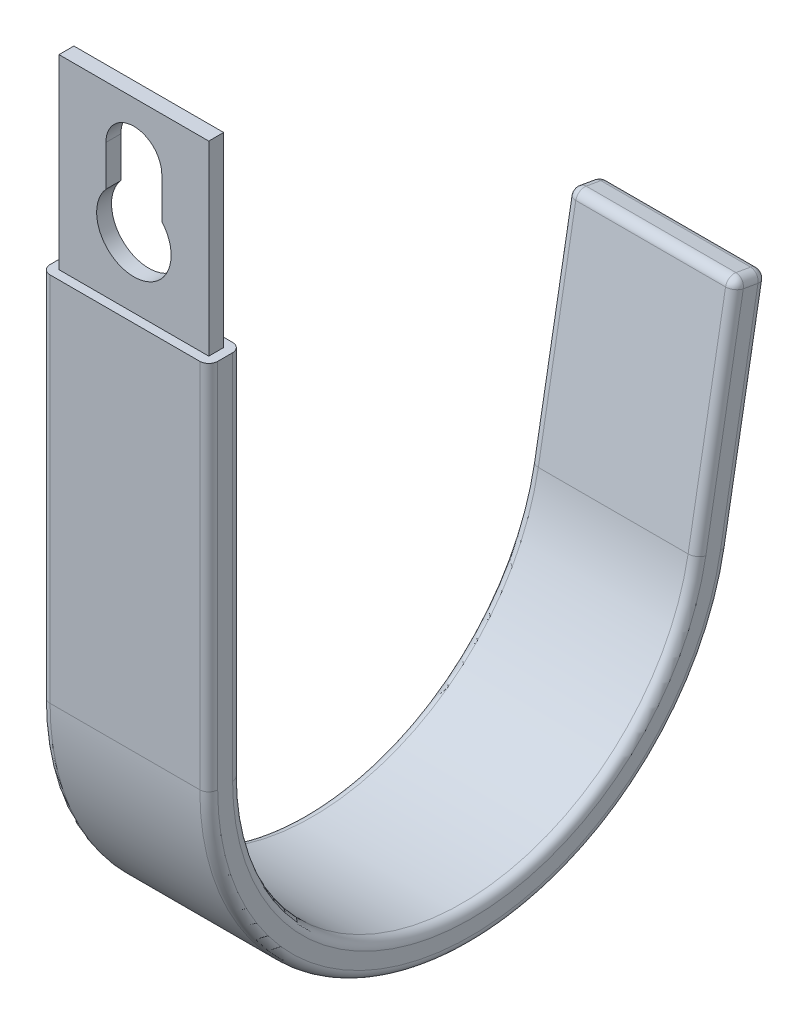
ISO-10303-21;
HEADER;
FILE_DESCRIPTION(('STEP AP214'),'2;1');
FILE_NAME('part.step','',(''),(''),'','','');
FILE_SCHEMA(('AUTOMOTIVE_DESIGN { 1 0 10303 214 1 1 1 1 }'));
ENDSEC;
DATA;
#1=APPLICATION_CONTEXT('core data for automotive mechanical design processes');
#2=APPLICATION_PROTOCOL_DEFINITION('international standard','automotive_design',2000,#1);
#3=PRODUCT_CONTEXT('',#1,'mechanical');
#4=PRODUCT('Part','Part','',(#3));
#5=PRODUCT_RELATED_PRODUCT_CATEGORY('part','',(#4));
#6=PRODUCT_DEFINITION_FORMATION('','',#4);
#7=PRODUCT_DEFINITION_CONTEXT('part definition',#1,'design');
#8=PRODUCT_DEFINITION('design','',#6,#7);
#9=PRODUCT_DEFINITION_SHAPE('','',#8);
#10=(LENGTH_UNIT() NAMED_UNIT(*) SI_UNIT(.MILLI.,.METRE.));
#11=(NAMED_UNIT(*) PLANE_ANGLE_UNIT() SI_UNIT($,.RADIAN.));
#12=(NAMED_UNIT(*) SI_UNIT($,.STERADIAN.) SOLID_ANGLE_UNIT());
#13=UNCERTAINTY_MEASURE_WITH_UNIT(LENGTH_MEASURE(1.E-05),#10,'distance_accuracy_value','');
#14=(GEOMETRIC_REPRESENTATION_CONTEXT(3) GLOBAL_UNCERTAINTY_ASSIGNED_CONTEXT((#13)) GLOBAL_UNIT_ASSIGNED_CONTEXT((#10,
#11,#12)) REPRESENTATION_CONTEXT('',''));
#15=CARTESIAN_POINT('',(0.,0.,0.));
#16=DIRECTION('',(0.,0.,1.));
#17=DIRECTION('',(1.,0.,0.));
#18=AXIS2_PLACEMENT_3D('',#15,#16,#17);
#19=CARTESIAN_POINT('',(-12.7635,0.,2.54));
#20=DIRECTION('',(1.,0.,0.));
#21=DIRECTION('',(0.,0.,-1.));
#22=AXIS2_PLACEMENT_3D('',#19,#20,#21);
#23=PLANE('',#22);
#24=DIRECTION('',(0.,0.,-1.));
#25=VECTOR('',#24,1.);
#26=CARTESIAN_POINT('',(-12.7635,63.246,2.54000000000001));
#27=LINE('',#26,#25);
#28=CARTESIAN_POINT('',(-12.7635,63.246,2.54000000000001));
#29=VERTEX_POINT('',#28);
#30=CARTESIAN_POINT('',(-12.7635,63.246,0.));
#31=VERTEX_POINT('',#30);
#32=EDGE_CURVE('E256',#29,#31,#27,.T.);
#33=ORIENTED_EDGE('',*,*,#32,.F.);
#34=DIRECTION('',(0.,1.,0.));
#35=VECTOR('',#34,1.);
#36=CARTESIAN_POINT('',(-12.7635,0.,2.54));
#37=LINE('',#36,#35);
#38=CARTESIAN_POINT('',(-12.7635,94.996,2.54));
#39=VERTEX_POINT('',#38);
#40=EDGE_CURVE('E283',#29,#39,#37,.T.);
#41=ORIENTED_EDGE('',*,*,#40,.T.);
#42=DIRECTION('',(0.,0.,-1.));
#43=VECTOR('',#42,1.);
#44=CARTESIAN_POINT('',(-12.7635,94.996,2.54));
#45=LINE('',#44,#43);
#46=CARTESIAN_POINT('',(-12.7635,94.996,0.));
#47=VERTEX_POINT('',#46);
#48=EDGE_CURVE('E271',#39,#47,#45,.T.);
#49=ORIENTED_EDGE('',*,*,#48,.T.);
#50=DIRECTION('',(0.,1.,0.));
#51=VECTOR('',#50,1.);
#52=CARTESIAN_POINT('',(-12.7635,0.,0.));
#53=LINE('',#52,#51);
#54=EDGE_CURVE('E289',#31,#47,#53,.T.);
#55=ORIENTED_EDGE('',*,*,#54,.F.);
#56=EDGE_LOOP('',(#33,#41,#49,#55));
#57=FACE_BOUND('',#56,.T.);
#58=ADVANCED_FACE('F32',(#57),#23,.F.);
#59=CARTESIAN_POINT('',(-12.7635,0.,0.));
#60=DIRECTION('',(0.,0.,1.));
#61=DIRECTION('',(0.,-1.,0.));
#62=AXIS2_PLACEMENT_3D('',#59,#60,#61);
#63=PLANE('',#62);
#64=DIRECTION('',(0.,1.,0.));
#65=VECTOR('',#64,1.);
#66=CARTESIAN_POINT('',(-4.7625,86.033369793685,0.));
#67=LINE('',#66,#65);
#68=CARTESIAN_POINT('',(-4.7625,79.121,0.));
#69=VERTEX_POINT('',#68);
#70=CARTESIAN_POINT('',(-4.7625,86.033369793685,0.));
#71=VERTEX_POINT('',#70);
#72=EDGE_CURVE('E217',#69,#71,#67,.T.);
#73=ORIENTED_EDGE('',*,*,#72,.F.);
#74=CARTESIAN_POINT('',(0.,74.920869793685,0.));
#75=DIRECTION('',(0.,0.,-1.));
#76=DIRECTION('',(0.,1.,0.));
#77=AXIS2_PLACEMENT_3D('',#74,#75,#76);
#78=CIRCLE('',#77,6.35);
#79=CARTESIAN_POINT('',(4.7625,79.121,0.));
#80=VERTEX_POINT('',#79);
#81=EDGE_CURVE('E47',#80,#69,#78,.T.);
#82=ORIENTED_EDGE('',*,*,#81,.F.);
#83=DIRECTION('',(0.,-1.,0.));
#84=VECTOR('',#83,1.);
#85=CARTESIAN_POINT('',(4.7625,86.033369793685,0.));
#86=LINE('',#85,#84);
#87=CARTESIAN_POINT('',(4.7625,86.033369793685,0.));
#88=VERTEX_POINT('',#87);
#89=EDGE_CURVE('E224',#88,#80,#86,.T.);
#90=ORIENTED_EDGE('',*,*,#89,.F.);
#91=CARTESIAN_POINT('',(0.,86.033369793685,0.));
#92=DIRECTION('',(0.,0.,-1.));
#93=DIRECTION('',(0.,1.,0.));
#94=AXIS2_PLACEMENT_3D('',#91,#92,#93);
#95=CIRCLE('',#94,4.7625);
#96=EDGE_CURVE('E208',#71,#88,#95,.T.);
#97=ORIENTED_EDGE('',*,*,#96,.F.);
#98=EDGE_LOOP('',(#73,#82,#90,#97));
#99=FACE_BOUND('',#98,.T.);
#100=DIRECTION('',(1.,0.,0.));
#101=VECTOR('',#100,1.);
#102=CARTESIAN_POINT('',(-12.7635,63.246,0.));
#103=LINE('',#102,#101);
#104=CARTESIAN_POINT('',(12.7635,63.246,0.));
#105=VERTEX_POINT('',#104);
#106=EDGE_CURVE('E253',#31,#105,#103,.T.);
#107=ORIENTED_EDGE('',*,*,#106,.F.);
#108=ORIENTED_EDGE('',*,*,#54,.T.);
#109=DIRECTION('',(1.,0.,0.));
#110=VECTOR('',#109,1.);
#111=CARTESIAN_POINT('',(-12.7635,94.996,0.));
#112=LINE('',#111,#110);
#113=CARTESIAN_POINT('',(12.7635,94.996,0.));
#114=VERTEX_POINT('',#113);
#115=EDGE_CURVE('E274',#47,#114,#112,.T.);
#116=ORIENTED_EDGE('',*,*,#115,.T.);
#117=DIRECTION('',(0.,1.,0.));
#118=VECTOR('',#117,1.);
#119=CARTESIAN_POINT('',(12.7635,0.,0.));
#120=LINE('',#119,#118);
#121=EDGE_CURVE('E287',#105,#114,#120,.T.);
#122=ORIENTED_EDGE('',*,*,#121,.F.);
#123=EDGE_LOOP('',(#107,#108,#116,#122));
#124=FACE_BOUND('',#123,.T.);
#125=ADVANCED_FACE('F221',(#99,#124),#63,.F.);
#126=CARTESIAN_POINT('',(12.7635,0.,2.54));
#127=DIRECTION('',(-1.,0.,0.));
#128=DIRECTION('',(0.,0.,1.));
#129=AXIS2_PLACEMENT_3D('',#126,#127,#128);
#130=PLANE('',#129);
#131=DIRECTION('',(0.,0.,1.));
#132=VECTOR('',#131,1.);
#133=CARTESIAN_POINT('',(12.7635,63.246,0.));
#134=LINE('',#133,#132);
#135=CARTESIAN_POINT('',(12.7635,63.246,2.54));
#136=VERTEX_POINT('',#135);
#137=EDGE_CURVE('E250',#105,#136,#134,.T.);
#138=ORIENTED_EDGE('',*,*,#137,.F.);
#139=ORIENTED_EDGE('',*,*,#121,.T.);
#140=DIRECTION('',(0.,0.,1.));
#141=VECTOR('',#140,1.);
#142=CARTESIAN_POINT('',(12.7635,94.996,2.54));
#143=LINE('',#142,#141);
#144=CARTESIAN_POINT('',(12.7635,94.996,2.54));
#145=VERTEX_POINT('',#144);
#146=EDGE_CURVE('E277',#114,#145,#143,.T.);
#147=ORIENTED_EDGE('',*,*,#146,.T.);
#148=DIRECTION('',(0.,1.,0.));
#149=VECTOR('',#148,1.);
#150=CARTESIAN_POINT('',(12.7635,0.,2.54));
#151=LINE('',#150,#149);
#152=EDGE_CURVE('E285',#136,#145,#151,.T.);
#153=ORIENTED_EDGE('',*,*,#152,.F.);
#154=EDGE_LOOP('',(#138,#139,#147,#153));
#155=FACE_BOUND('',#154,.T.);
#156=ADVANCED_FACE('F451',(#155),#130,.F.);
#157=CARTESIAN_POINT('',(-12.7635,0.,2.54));
#158=DIRECTION('',(0.,0.,-1.));
#159=DIRECTION('',(-1.,0.,0.));
#160=AXIS2_PLACEMENT_3D('',#157,#158,#159);
#161=PLANE('',#160);
#162=DIRECTION('',(0.,-1.,0.));
#163=VECTOR('',#162,1.);
#164=CARTESIAN_POINT('',(4.76250000000001,0.,2.54));
#165=LINE('',#164,#163);
#166=CARTESIAN_POINT('',(4.7625,86.033369793685,2.54));
#167=VERTEX_POINT('',#166);
#168=CARTESIAN_POINT('',(4.7625,79.121,2.54));
#169=VERTEX_POINT('',#168);
#170=EDGE_CURVE('E40',#167,#169,#165,.T.);
#171=ORIENTED_EDGE('',*,*,#170,.T.);
#172=CARTESIAN_POINT('',(0.,74.920869793685,2.54));
#173=DIRECTION('',(0.,0.,-1.));
#174=DIRECTION('',(-1.,0.,0.));
#175=AXIS2_PLACEMENT_3D('',#172,#173,#174);
#176=CIRCLE('',#175,6.35);
#177=CARTESIAN_POINT('',(-4.7625,79.121,2.54));
#178=VERTEX_POINT('',#177);
#179=EDGE_CURVE('E11',#169,#178,#176,.T.);
#180=ORIENTED_EDGE('',*,*,#179,.T.);
#181=DIRECTION('',(0.,1.,0.));
#182=VECTOR('',#181,1.);
#183=CARTESIAN_POINT('',(-4.76250000000001,0.,2.54));
#184=LINE('',#183,#182);
#185=CARTESIAN_POINT('',(-4.7625,86.033369793685,2.54));
#186=VERTEX_POINT('',#185);
#187=EDGE_CURVE('E365',#178,#186,#184,.T.);
#188=ORIENTED_EDGE('',*,*,#187,.T.);
#189=CARTESIAN_POINT('',(0.,86.033369793685,2.54));
#190=DIRECTION('',(0.,0.,-1.));
#191=DIRECTION('',(-1.,0.,0.));
#192=AXIS2_PLACEMENT_3D('',#189,#190,#191);
#193=CIRCLE('',#192,4.7625);
#194=EDGE_CURVE('E211',#186,#167,#193,.T.);
#195=ORIENTED_EDGE('',*,*,#194,.T.);
#196=EDGE_LOOP('',(#171,#180,#188,#195));
#197=FACE_BOUND('',#196,.T.);
#198=DIRECTION('',(-1.,0.,0.));
#199=VECTOR('',#198,1.);
#200=CARTESIAN_POINT('',(12.7635,63.246,2.54000000000001));
#201=LINE('',#200,#199);
#202=EDGE_CURVE('E247',#136,#29,#201,.T.);
#203=ORIENTED_EDGE('',*,*,#202,.F.);
#204=ORIENTED_EDGE('',*,*,#152,.T.);
#205=DIRECTION('',(-1.,0.,0.));
#206=VECTOR('',#205,1.);
#207=CARTESIAN_POINT('',(-12.7635,94.996,2.54));
#208=LINE('',#207,#206);
#209=EDGE_CURVE('E280',#145,#39,#208,.T.);
#210=ORIENTED_EDGE('',*,*,#209,.T.);
#211=ORIENTED_EDGE('',*,*,#40,.F.);
#212=EDGE_LOOP('',(#203,#204,#210,#211));
#213=FACE_BOUND('',#212,.T.);
#214=ADVANCED_FACE('F426',(#197,#213),#161,.F.);
#215=CARTESIAN_POINT('',(0.,94.996,0.));
#216=DIRECTION('',(0.,-1.,0.));
#217=DIRECTION('',(0.,0.,-1.));
#218=AXIS2_PLACEMENT_3D('',#215,#216,#217);
#219=PLANE('',#218);
#220=ORIENTED_EDGE('',*,*,#48,.F.);
#221=ORIENTED_EDGE('',*,*,#209,.F.);
#222=ORIENTED_EDGE('',*,*,#146,.F.);
#223=ORIENTED_EDGE('',*,*,#115,.F.);
#224=EDGE_LOOP('',(#220,#221,#222,#223));
#225=FACE_BOUND('',#224,.T.);
#226=ADVANCED_FACE('F622',(#225),#219,.F.);
#227=CARTESIAN_POINT('',(-14.2875,0.,-1.524));
#228=DIRECTION('',(0.,0.,1.));
#229=DIRECTION('',(0.,-1.,0.));
#230=AXIS2_PLACEMENT_3D('',#227,#228,#229);
#231=PLANE('',#230);
#232=DIRECTION('',(1.,0.,0.));
#233=VECTOR('',#232,1.);
#234=CARTESIAN_POINT('',(-14.2875,0.,-1.524));
#235=LINE('',#234,#233);
#236=CARTESIAN_POINT('',(-12.7635,0.,-1.524));
#237=VERTEX_POINT('',#236);
#238=CARTESIAN_POINT('',(12.7635,0.,-1.524));
#239=VERTEX_POINT('',#238);
#240=EDGE_CURVE('E244',#237,#239,#235,.T.);
#241=ORIENTED_EDGE('',*,*,#240,.F.);
#242=DIRECTION('',(0.,1.,0.));
#243=VECTOR('',#242,1.);
#244=CARTESIAN_POINT('',(-12.7635,63.246,-1.524));
#245=LINE('',#244,#243);
#246=CARTESIAN_POINT('',(-12.7635,63.246,-1.524));
#247=VERTEX_POINT('',#246);
#248=EDGE_CURVE('E293',#237,#247,#245,.T.);
#249=ORIENTED_EDGE('',*,*,#248,.T.);
#250=DIRECTION('',(1.,0.,0.));
#251=VECTOR('',#250,1.);
#252=CARTESIAN_POINT('',(-14.2875,63.246,-1.524));
#253=LINE('',#252,#251);
#254=CARTESIAN_POINT('',(12.7635,63.246,-1.524));
#255=VERTEX_POINT('',#254);
#256=EDGE_CURVE('E268',#247,#255,#253,.T.);
#257=ORIENTED_EDGE('',*,*,#256,.T.);
#258=DIRECTION('',(0.,1.,0.));
#259=VECTOR('',#258,1.);
#260=CARTESIAN_POINT('',(12.7635,0.,-1.524));
#261=LINE('',#260,#259);
#262=EDGE_CURVE('E291',#255,#239,#261,.F.);
#263=ORIENTED_EDGE('',*,*,#262,.T.);
#264=EDGE_LOOP('',(#241,#249,#257,#263));
#265=FACE_BOUND('',#264,.T.);
#266=ADVANCED_FACE('F589',(#265),#231,.F.);
#267=CARTESIAN_POINT('',(14.2875,0.,4.06400000000001));
#268=DIRECTION('',(0.,0.,-1.));
#269=DIRECTION('',(0.,1.,0.));
#270=AXIS2_PLACEMENT_3D('',#267,#268,#269);
#271=PLANE('',#270);
#272=DIRECTION('',(-1.,0.,0.));
#273=VECTOR('',#272,1.);
#274=CARTESIAN_POINT('',(14.2875,63.246,4.06400000000001));
#275=LINE('',#274,#273);
#276=CARTESIAN_POINT('',(12.7635,63.246,4.06400000000001));
#277=VERTEX_POINT('',#276);
#278=CARTESIAN_POINT('',(-12.7635,63.246,4.06400000000001));
#279=VERTEX_POINT('',#278);
#280=EDGE_CURVE('E262',#277,#279,#275,.T.);
#281=ORIENTED_EDGE('',*,*,#280,.T.);
#282=DIRECTION('',(0.,1.,0.));
#283=VECTOR('',#282,1.);
#284=CARTESIAN_POINT('',(-12.7635,0.,4.06400000000001));
#285=LINE('',#284,#283);
#286=CARTESIAN_POINT('',(-12.7635,0.,4.06400000000001));
#287=VERTEX_POINT('',#286);
#288=EDGE_CURVE('E324',#279,#287,#285,.F.);
#289=ORIENTED_EDGE('',*,*,#288,.T.);
#290=DIRECTION('',(-1.,0.,0.));
#291=VECTOR('',#290,1.);
#292=CARTESIAN_POINT('',(14.2875,0.,4.06400000000001));
#293=LINE('',#292,#291);
#294=CARTESIAN_POINT('',(12.7635,0.,4.06400000000001));
#295=VERTEX_POINT('',#294);
#296=EDGE_CURVE('E241',#295,#287,#293,.T.);
#297=ORIENTED_EDGE('',*,*,#296,.F.);
#298=DIRECTION('',(0.,1.,0.));
#299=VECTOR('',#298,1.);
#300=CARTESIAN_POINT('',(12.7635,63.246,4.06400000000001));
#301=LINE('',#300,#299);
#302=EDGE_CURVE('E322',#295,#277,#301,.T.);
#303=ORIENTED_EDGE('',*,*,#302,.T.);
#304=EDGE_LOOP('',(#281,#289,#297,#303));
#305=FACE_BOUND('',#304,.T.);
#306=ADVANCED_FACE('F540',(#305),#271,.F.);
#307=CARTESIAN_POINT('',(0.,0.,-40.64));
#308=DIRECTION('',(-1.,0.,0.));
#309=DIRECTION('',(0.,0.,1.));
#310=AXIS2_PLACEMENT_3D('',#307,#308,#309);
#311=CYLINDRICAL_SURFACE('',#310,39.116);
#312=DIRECTION('',(1.,0.,0.));
#313=VECTOR('',#312,1.);
#314=CARTESIAN_POINT('',(-14.2875,-6.79242211761937,-79.1617400668256));
#315=LINE('',#314,#313);
#316=CARTESIAN_POINT('',(-12.7635,-6.79242211761937,-79.1617400668256));
#317=VERTEX_POINT('',#316);
#318=CARTESIAN_POINT('',(12.7635,-6.79242211761937,-79.1617400668256));
#319=VERTEX_POINT('',#318);
#320=EDGE_CURVE('E237',#317,#319,#315,.T.);
#321=ORIENTED_EDGE('',*,*,#320,.F.);
#322=CARTESIAN_POINT('',(-12.7635,0.,-40.64));
#323=DIRECTION('',(-1.,0.,0.));
#324=DIRECTION('',(0.,0.,1.));
#325=AXIS2_PLACEMENT_3D('',#322,#323,#324);
#326=CIRCLE('',#325,39.116);
#327=EDGE_CURVE('E320',#317,#237,#326,.T.);
#328=ORIENTED_EDGE('',*,*,#327,.T.);
#329=ORIENTED_EDGE('',*,*,#240,.T.);
#330=CARTESIAN_POINT('',(12.7635,0.,-40.64));
#331=DIRECTION('',(1.,0.,0.));
#332=DIRECTION('',(0.,0.,-1.));
#333=AXIS2_PLACEMENT_3D('',#330,#331,#332);
#334=CIRCLE('',#333,39.116);
#335=EDGE_CURVE('E318',#239,#319,#334,.T.);
#336=ORIENTED_EDGE('',*,*,#335,.T.);
#337=EDGE_LOOP('',(#321,#328,#329,#336));
#338=FACE_BOUND('',#337,.T.);
#339=ADVANCED_FACE('F609',(#338),#311,.F.);
#340=CARTESIAN_POINT('',(0.,0.,-40.64));
#341=DIRECTION('',(-1.,0.,0.));
#342=DIRECTION('',(0.,0.,1.));
#343=AXIS2_PLACEMENT_3D('',#340,#341,#342);
#344=CYLINDRICAL_SURFACE('',#343,44.704);
#345=ORIENTED_EDGE('',*,*,#296,.T.);
#346=CARTESIAN_POINT('',(-12.7635,0.,-40.64));
#347=DIRECTION('',(-1.,0.,0.));
#348=DIRECTION('',(0.,0.,1.));
#349=AXIS2_PLACEMENT_3D('',#346,#347,#348);
#350=CIRCLE('',#349,44.704);
#351=CARTESIAN_POINT('',(-12.7635,-7.76276813442214,-84.6648457906578));
#352=VERTEX_POINT('',#351);
#353=EDGE_CURVE('E328',#287,#352,#350,.F.);
#354=ORIENTED_EDGE('',*,*,#353,.T.);
#355=DIRECTION('',(-1.,0.,0.));
#356=VECTOR('',#355,1.);
#357=CARTESIAN_POINT('',(14.2875,-7.76276813442214,-84.6648457906578));
#358=LINE('',#357,#356);
#359=CARTESIAN_POINT('',(12.7635,-7.76276813442214,-84.6648457906578));
#360=VERTEX_POINT('',#359);
#361=EDGE_CURVE('E234',#360,#352,#358,.T.);
#362=ORIENTED_EDGE('',*,*,#361,.F.);
#363=CARTESIAN_POINT('',(12.7635,0.,-40.64));
#364=DIRECTION('',(1.,0.,0.));
#365=DIRECTION('',(0.,0.,-1.));
#366=AXIS2_PLACEMENT_3D('',#363,#364,#365);
#367=CIRCLE('',#366,44.704);
#368=EDGE_CURVE('E326',#360,#295,#367,.F.);
#369=ORIENTED_EDGE('',*,*,#368,.T.);
#370=EDGE_LOOP('',(#345,#354,#362,#369));
#371=FACE_BOUND('',#370,.T.);
#372=ADVANCED_FACE('F552',(#371),#344,.T.);
#373=CARTESIAN_POINT('',(14.2875,-6.79242211761937,-79.1617400668256));
#374=DIRECTION('',(1.,0.,0.));
#375=DIRECTION('',(0.,0.,-1.));
#376=AXIS2_PLACEMENT_3D('',#373,#374,#375);
#377=PLANE('',#376);
#378=DIRECTION('',(0.,0.,1.));
#379=VECTOR('',#378,1.);
#380=CARTESIAN_POINT('',(14.2875,63.246,-1.524));
#381=LINE('',#380,#379);
#382=CARTESIAN_POINT('',(14.2875,63.246,0.));
#383=VERTEX_POINT('',#382);
#384=CARTESIAN_POINT('',(14.2875,63.246,2.54000000000001));
#385=VERTEX_POINT('',#384);
#386=EDGE_CURVE('E259',#383,#385,#381,.T.);
#387=ORIENTED_EDGE('',*,*,#386,.T.);
#388=DIRECTION('',(0.,1.,0.));
#389=VECTOR('',#388,1.);
#390=CARTESIAN_POINT('',(14.2875,0.,2.54000000000001));
#391=LINE('',#390,#389);
#392=CARTESIAN_POINT('',(14.2875,0.,2.54000000000001));
#393=VERTEX_POINT('',#392);
#394=EDGE_CURVE('E342',#385,#393,#391,.F.);
#395=ORIENTED_EDGE('',*,*,#394,.T.);
#396=CARTESIAN_POINT('',(14.2875,0.,-40.64));
#397=DIRECTION('',(1.,0.,0.));
#398=DIRECTION('',(0.,0.,-1.));
#399=AXIS2_PLACEMENT_3D('',#396,#397,#398);
#400=CIRCLE('',#399,43.18);
#401=CARTESIAN_POINT('',(14.2875,-7.49812831165775,-83.1639987750672));
#402=VERTEX_POINT('',#401);
#403=EDGE_CURVE('E340',#393,#402,#400,.T.);
#404=ORIENTED_EDGE('',*,*,#403,.T.);
#405=DIRECTION('',(0.,0.984807753012209,-0.173648177666923));
#406=VECTOR('',#405,1.);
#407=CARTESIAN_POINT('',(14.2875,-7.49812831165775,-83.1639987750672));
#408=LINE('',#407,#406);
#409=CARTESIAN_POINT('',(14.2875,28.7145549042872,-89.5492718698866));
#410=VERTEX_POINT('',#409);
#411=EDGE_CURVE('E338',#402,#410,#408,.T.);
#412=ORIENTED_EDGE('',*,*,#411,.T.);
#413=DIRECTION('',(0.,-0.173648177666923,-0.984807753012209));
#414=VECTOR('',#413,1.);
#415=CARTESIAN_POINT('',(14.2875,29.4202610983256,-85.547013161645));
#416=LINE('',#415,#414);
#417=CARTESIAN_POINT('',(14.2875,29.1556212755612,-87.0478601772356));
#418=VERTEX_POINT('',#417);
#419=EDGE_CURVE('E336',#410,#418,#416,.F.);
#420=ORIENTED_EDGE('',*,*,#419,.T.);
#421=DIRECTION('',(0.,0.984807753012209,-0.173648177666923));
#422=VECTOR('',#421,1.);
#423=CARTESIAN_POINT('',(14.2875,-7.05706194038376,-80.6625870824162));
#424=LINE('',#423,#422);
#425=CARTESIAN_POINT('',(14.2875,-7.05706194038376,-80.6625870824162));
#426=VERTEX_POINT('',#425);
#427=EDGE_CURVE('E334',#418,#426,#424,.F.);
#428=ORIENTED_EDGE('',*,*,#427,.T.);
#429=CARTESIAN_POINT('',(14.2875,0.,-40.64));
#430=DIRECTION('',(1.,0.,0.));
#431=DIRECTION('',(0.,0.,-1.));
#432=AXIS2_PLACEMENT_3D('',#429,#430,#431);
#433=CIRCLE('',#432,40.64);
#434=CARTESIAN_POINT('',(14.2875,0.,0.));
#435=VERTEX_POINT('',#434);
#436=EDGE_CURVE('E330',#426,#435,#433,.F.);
#437=ORIENTED_EDGE('',*,*,#436,.T.);
#438=DIRECTION('',(0.,1.,0.));
#439=VECTOR('',#438,1.);
#440=CARTESIAN_POINT('',(14.2875,63.246,0.));
#441=LINE('',#440,#439);
#442=EDGE_CURVE('E332',#435,#383,#441,.T.);
#443=ORIENTED_EDGE('',*,*,#442,.T.);
#444=EDGE_LOOP('',(#387,#395,#404,#412,#420,#428,#437,#443));
#445=FACE_BOUND('',#444,.T.);
#446=ADVANCED_FACE('F576',(#445),#377,.T.);
#447=CARTESIAN_POINT('',(-14.2875,-6.79242211761937,-79.1617400668256));
#448=DIRECTION('',(0.,0.173648177666923,0.984807753012209));
#449=DIRECTION('',(0.,-0.984807753012209,0.173648177666923));
#450=AXIS2_PLACEMENT_3D('',#447,#448,#449);
#451=PLANE('',#450);
#452=ORIENTED_EDGE('',*,*,#320,.T.);
#453=DIRECTION('',(0.,0.984807753012209,-0.173648177666923));
#454=VECTOR('',#453,1.);
#455=CARTESIAN_POINT('',(12.7635,-6.79242211761937,-79.1617400668256));
#456=LINE('',#455,#454);
#457=CARTESIAN_POINT('',(12.7635,29.4202610983256,-85.547013161645));
#458=VERTEX_POINT('',#457);
#459=EDGE_CURVE('E354',#319,#458,#456,.T.);
#460=ORIENTED_EDGE('',*,*,#459,.T.);
#461=DIRECTION('',(1.,0.,0.));
#462=VECTOR('',#461,1.);
#463=CARTESIAN_POINT('',(-14.2875,29.4202610983256,-85.547013161645));
#464=LINE('',#463,#462);
#465=CARTESIAN_POINT('',(-12.7635,29.4202610983256,-85.547013161645));
#466=VERTEX_POINT('',#465);
#467=EDGE_CURVE('E352',#458,#466,#464,.F.);
#468=ORIENTED_EDGE('',*,*,#467,.T.);
#469=DIRECTION('',(0.,0.984807753012209,-0.173648177666923));
#470=VECTOR('',#469,1.);
#471=CARTESIAN_POINT('',(-12.7635,-6.79242211761937,-79.1617400668256));
#472=LINE('',#471,#470);
#473=EDGE_CURVE('E350',#466,#317,#472,.F.);
#474=ORIENTED_EDGE('',*,*,#473,.T.);
#475=EDGE_LOOP('',(#452,#460,#468,#474));
#476=FACE_BOUND('',#475,.T.);
#477=ADVANCED_FACE('F606',(#476),#451,.T.);
#478=CARTESIAN_POINT('',(-14.2875,-7.76276813442214,-84.6648457906578));
#479=DIRECTION('',(-1.,0.,0.));
#480=DIRECTION('',(0.,0.,1.));
#481=AXIS2_PLACEMENT_3D('',#478,#479,#480);
#482=PLANE('',#481);
#483=DIRECTION('',(0.,0.,-1.));
#484=VECTOR('',#483,1.);
#485=CARTESIAN_POINT('',(-14.2875,63.246,4.06400000000001));
#486=LINE('',#485,#484);
#487=CARTESIAN_POINT('',(-14.2875,63.246,2.54000000000001));
#488=VERTEX_POINT('',#487);
#489=CARTESIAN_POINT('',(-14.2875,63.246,0.));
#490=VERTEX_POINT('',#489);
#491=EDGE_CURVE('E265',#488,#490,#486,.T.);
#492=ORIENTED_EDGE('',*,*,#491,.T.);
#493=DIRECTION('',(0.,1.,0.));
#494=VECTOR('',#493,1.);
#495=CARTESIAN_POINT('',(-14.2875,0.,0.));
#496=LINE('',#495,#494);
#497=CARTESIAN_POINT('',(-14.2875,0.,0.));
#498=VERTEX_POINT('',#497);
#499=EDGE_CURVE('E316',#490,#498,#496,.F.);
#500=ORIENTED_EDGE('',*,*,#499,.T.);
#501=CARTESIAN_POINT('',(-14.2875,0.,-40.64));
#502=DIRECTION('',(-1.,0.,0.));
#503=DIRECTION('',(0.,0.,1.));
#504=AXIS2_PLACEMENT_3D('',#501,#502,#503);
#505=CIRCLE('',#504,40.64);
#506=CARTESIAN_POINT('',(-14.2875,-7.05706194038376,-80.6625870824162));
#507=VERTEX_POINT('',#506);
#508=EDGE_CURVE('E314',#498,#507,#505,.F.);
#509=ORIENTED_EDGE('',*,*,#508,.T.);
#510=DIRECTION('',(0.,0.984807753012209,-0.173648177666923));
#511=VECTOR('',#510,1.);
#512=CARTESIAN_POINT('',(-14.2875,-7.05706194038376,-80.6625870824162));
#513=LINE('',#512,#511);
#514=CARTESIAN_POINT('',(-14.2875,29.1556212755612,-87.0478601772356));
#515=VERTEX_POINT('',#514);
#516=EDGE_CURVE('E312',#507,#515,#513,.T.);
#517=ORIENTED_EDGE('',*,*,#516,.T.);
#518=DIRECTION('',(0.,0.173648177666923,0.984807753012209));
#519=VECTOR('',#518,1.);
#520=CARTESIAN_POINT('',(-14.2875,28.4499150815228,-91.0501188854773));
#521=LINE('',#520,#519);
#522=CARTESIAN_POINT('',(-14.2875,28.7145549042872,-89.5492718698866));
#523=VERTEX_POINT('',#522);
#524=EDGE_CURVE('E306',#515,#523,#521,.F.);
#525=ORIENTED_EDGE('',*,*,#524,.T.);
#526=DIRECTION('',(0.,0.984807753012209,-0.173648177666923));
#527=VECTOR('',#526,1.);
#528=CARTESIAN_POINT('',(-14.2875,-7.49812831165775,-83.1639987750672));
#529=LINE('',#528,#527);
#530=CARTESIAN_POINT('',(-14.2875,-7.49812831165775,-83.1639987750672));
#531=VERTEX_POINT('',#530);
#532=EDGE_CURVE('E304',#523,#531,#529,.F.);
#533=ORIENTED_EDGE('',*,*,#532,.T.);
#534=CARTESIAN_POINT('',(-14.2875,0.,-40.64));
#535=DIRECTION('',(-1.,0.,0.));
#536=DIRECTION('',(0.,0.,1.));
#537=AXIS2_PLACEMENT_3D('',#534,#535,#536);
#538=CIRCLE('',#537,43.18);
#539=CARTESIAN_POINT('',(-14.2875,0.,2.54000000000001));
#540=VERTEX_POINT('',#539);
#541=EDGE_CURVE('E308',#531,#540,#538,.T.);
#542=ORIENTED_EDGE('',*,*,#541,.T.);
#543=DIRECTION('',(0.,1.,0.));
#544=VECTOR('',#543,1.);
#545=CARTESIAN_POINT('',(-14.2875,63.246,2.54000000000001));
#546=LINE('',#545,#544);
#547=EDGE_CURVE('E310',#540,#488,#546,.T.);
#548=ORIENTED_EDGE('',*,*,#547,.T.);
#549=EDGE_LOOP('',(#492,#500,#509,#517,#525,#533,#542,#548));
#550=FACE_BOUND('',#549,.T.);
#551=ADVANCED_FACE('F594',(#550),#482,.T.);
#552=CARTESIAN_POINT('',(14.2875,-7.76276813442214,-84.6648457906578));
#553=DIRECTION('',(0.,-0.173648177666923,-0.984807753012209));
#554=DIRECTION('',(0.,0.984807753012209,-0.173648177666923));
#555=AXIS2_PLACEMENT_3D('',#552,#553,#554);
#556=PLANE('',#555);
#557=DIRECTION('',(-1.,0.,0.));
#558=VECTOR('',#557,1.);
#559=CARTESIAN_POINT('',(14.2875,28.4499150815228,-91.0501188854772));
#560=LINE('',#559,#558);
#561=CARTESIAN_POINT('',(-12.7635,28.4499150815228,-91.0501188854772));
#562=VERTEX_POINT('',#561);
#563=CARTESIAN_POINT('',(12.7635,28.4499150815228,-91.0501188854772));
#564=VERTEX_POINT('',#563);
#565=EDGE_CURVE('E346',#562,#564,#560,.F.);
#566=ORIENTED_EDGE('',*,*,#565,.T.);
#567=DIRECTION('',(0.,0.984807753012209,-0.173648177666923));
#568=VECTOR('',#567,1.);
#569=CARTESIAN_POINT('',(12.7635,-7.76276813442214,-84.6648457906578));
#570=LINE('',#569,#568);
#571=EDGE_CURVE('E348',#564,#360,#570,.F.);
#572=ORIENTED_EDGE('',*,*,#571,.T.);
#573=ORIENTED_EDGE('',*,*,#361,.T.);
#574=DIRECTION('',(0.,0.984807753012209,-0.173648177666923));
#575=VECTOR('',#574,1.);
#576=CARTESIAN_POINT('',(-12.7635,-7.76276813442214,-84.6648457906578));
#577=LINE('',#576,#575);
#578=EDGE_CURVE('E344',#352,#562,#577,.T.);
#579=ORIENTED_EDGE('',*,*,#578,.T.);
#580=EDGE_LOOP('',(#566,#572,#573,#579));
#581=FACE_BOUND('',#580,.T.);
#582=ADVANCED_FACE('F556',(#581),#556,.T.);
#583=CARTESIAN_POINT('',(0.,63.246,-80.6625870824162));
#584=DIRECTION('',(0.,-1.,0.));
#585=DIRECTION('',(0.,0.,-1.));
#586=AXIS2_PLACEMENT_3D('',#583,#584,#585);
#587=PLANE('',#586);
#588=ORIENTED_EDGE('',*,*,#202,.T.);
#589=ORIENTED_EDGE('',*,*,#32,.T.);
#590=ORIENTED_EDGE('',*,*,#106,.T.);
#591=ORIENTED_EDGE('',*,*,#137,.T.);
#592=EDGE_LOOP('',(#588,#589,#590,#591));
#593=FACE_BOUND('',#592,.T.);
#594=ORIENTED_EDGE('',*,*,#256,.F.);
#595=CARTESIAN_POINT('',(-12.7635,63.246,0.));
#596=DIRECTION('',(0.,-1.,0.));
#597=DIRECTION('',(0.,0.,-1.));
#598=AXIS2_PLACEMENT_3D('',#595,#596,#597);
#599=CIRCLE('',#598,1.524);
#600=EDGE_CURVE('E302',#247,#490,#599,.F.);
#601=ORIENTED_EDGE('',*,*,#600,.T.);
#602=ORIENTED_EDGE('',*,*,#491,.F.);
#603=CARTESIAN_POINT('',(-12.7635,63.246,2.54000000000001));
#604=DIRECTION('',(0.,-1.,0.));
#605=DIRECTION('',(0.,0.,-1.));
#606=AXIS2_PLACEMENT_3D('',#603,#604,#605);
#607=CIRCLE('',#606,1.524);
#608=EDGE_CURVE('E300',#488,#279,#607,.F.);
#609=ORIENTED_EDGE('',*,*,#608,.T.);
#610=ORIENTED_EDGE('',*,*,#280,.F.);
#611=CARTESIAN_POINT('',(12.7635,63.246,2.54000000000001));
#612=DIRECTION('',(0.,-1.,0.));
#613=DIRECTION('',(0.,0.,-1.));
#614=AXIS2_PLACEMENT_3D('',#611,#612,#613);
#615=CIRCLE('',#614,1.524);
#616=EDGE_CURVE('E298',#277,#385,#615,.F.);
#617=ORIENTED_EDGE('',*,*,#616,.T.);
#618=ORIENTED_EDGE('',*,*,#386,.F.);
#619=CARTESIAN_POINT('',(12.7635,63.246,0.));
#620=DIRECTION('',(0.,-1.,0.));
#621=DIRECTION('',(0.,0.,-1.));
#622=AXIS2_PLACEMENT_3D('',#619,#620,#621);
#623=CIRCLE('',#622,1.524);
#624=EDGE_CURVE('E296',#383,#255,#623,.F.);
#625=ORIENTED_EDGE('',*,*,#624,.T.);
#626=EDGE_LOOP('',(#594,#601,#602,#609,#610,#617,#618,#625));
#627=FACE_BOUND('',#626,.T.);
#628=ADVANCED_FACE('F544',(#593,#627),#587,.F.);
#629=CARTESIAN_POINT('',(0.,30.6564682911518,-87.3125));
#630=DIRECTION('',(0.,0.984807753012209,-0.173648177666923));
#631=DIRECTION('',(0.,0.173648177666923,0.984807753012209));
#632=AXIS2_PLACEMENT_3D('',#629,#630,#631);
#633=PLANE('',#632);
#634=DIRECTION('',(0.,0.173648177666923,0.984807753012209));
#635=VECTOR('',#634,1.);
#636=CARTESIAN_POINT('',(-12.7635,30.6564682911518,-87.3125));
#637=LINE('',#636,#635);
#638=CARTESIAN_POINT('',(-12.7635,30.2154019198778,-89.813911692651));
#639=VERTEX_POINT('',#638);
#640=CARTESIAN_POINT('',(-12.7635,30.6564682911518,-87.3125));
#641=VERTEX_POINT('',#640);
#642=EDGE_CURVE('E360',#639,#641,#637,.T.);
#643=ORIENTED_EDGE('',*,*,#642,.T.);
#644=DIRECTION('',(1.,0.,0.));
#645=VECTOR('',#644,1.);
#646=CARTESIAN_POINT('',(0.,30.6564682911518,-87.3125));
#647=LINE('',#646,#645);
#648=CARTESIAN_POINT('',(12.7635,30.6564682911518,-87.3125));
#649=VERTEX_POINT('',#648);
#650=EDGE_CURVE('E362',#641,#649,#647,.T.);
#651=ORIENTED_EDGE('',*,*,#650,.T.);
#652=DIRECTION('',(0.,-0.173648177666923,-0.984807753012209));
#653=VECTOR('',#652,1.);
#654=CARTESIAN_POINT('',(12.7635,30.6564682911518,-87.3125));
#655=LINE('',#654,#653);
#656=CARTESIAN_POINT('',(12.7635,30.2154019198778,-89.813911692651));
#657=VERTEX_POINT('',#656);
#658=EDGE_CURVE('E356',#649,#657,#655,.T.);
#659=ORIENTED_EDGE('',*,*,#658,.T.);
#660=DIRECTION('',(-1.,0.,0.));
#661=VECTOR('',#660,1.);
#662=CARTESIAN_POINT('',(0.,30.2154019198778,-89.813911692651));
#663=LINE('',#662,#661);
#664=EDGE_CURVE('E358',#657,#639,#663,.T.);
#665=ORIENTED_EDGE('',*,*,#664,.T.);
#666=EDGE_LOOP('',(#643,#651,#659,#665));
#667=FACE_BOUND('',#666,.T.);
#668=ADVANCED_FACE('F528',(#667),#633,.T.);
#669=CARTESIAN_POINT('',(12.7635,0.,2.54000000000001));
#670=DIRECTION('',(0.,-1.,0.));
#671=DIRECTION('',(0.,0.,-1.));
#672=AXIS2_PLACEMENT_3D('',#669,#670,#671);
#673=CYLINDRICAL_SURFACE('',#672,1.524);
#674=ORIENTED_EDGE('',*,*,#616,.F.);
#675=ORIENTED_EDGE('',*,*,#302,.F.);
#676=CARTESIAN_POINT('',(12.7635,0.,2.54000000000001));
#677=DIRECTION('',(0.,-1.,0.));
#678=DIRECTION('',(0.,0.,-1.));
#679=AXIS2_PLACEMENT_3D('',#676,#677,#678);
#680=CIRCLE('',#679,1.524);
#681=EDGE_CURVE('E238',#393,#295,#680,.T.);
#682=ORIENTED_EDGE('',*,*,#681,.F.);
#683=ORIENTED_EDGE('',*,*,#394,.F.);
#684=EDGE_LOOP('',(#674,#675,#682,#683));
#685=FACE_BOUND('',#684,.T.);
#686=ADVANCED_FACE('F34',(#685),#673,.T.);
#687=CARTESIAN_POINT('',(12.7635,0.,-40.64));
#688=DIRECTION('',(1.,0.,0.));
#689=DIRECTION('',(0.,0.,-1.));
#690=AXIS2_PLACEMENT_3D('',#687,#688,#689);
#691=TOROIDAL_SURFACE('',#690,43.18,1.524);
#692=ORIENTED_EDGE('',*,*,#681,.T.);
#693=ORIENTED_EDGE('',*,*,#368,.F.);
#694=CARTESIAN_POINT('',(12.7635,-7.49812831165775,-83.1639987750672));
#695=DIRECTION('',(0.,0.984807753012209,-0.173648177666922));
#696=DIRECTION('',(0.,0.173648177666922,0.984807753012209));
#697=AXIS2_PLACEMENT_3D('',#694,#695,#696);
#698=CIRCLE('',#697,1.524);
#699=EDGE_CURVE('E418',#402,#360,#698,.T.);
#700=ORIENTED_EDGE('',*,*,#699,.F.);
#701=ORIENTED_EDGE('',*,*,#403,.F.);
#702=EDGE_LOOP('',(#692,#693,#700,#701));
#703=FACE_BOUND('',#702,.T.);
#704=ADVANCED_FACE('F521',(#703),#691,.T.);
#705=CARTESIAN_POINT('',(-12.7635,-7.76276813442213,2.54000000000001));
#706=DIRECTION('',(0.,-1.,0.));
#707=DIRECTION('',(0.,0.,-1.));
#708=AXIS2_PLACEMENT_3D('',#705,#706,#707);
#709=CYLINDRICAL_SURFACE('',#708,1.524);
#710=ORIENTED_EDGE('',*,*,#608,.F.);
#711=ORIENTED_EDGE('',*,*,#547,.F.);
#712=CARTESIAN_POINT('',(-12.7635,0.,2.54000000000001));
#713=DIRECTION('',(0.,-1.,0.));
#714=DIRECTION('',(0.,0.,-1.));
#715=AXIS2_PLACEMENT_3D('',#712,#713,#714);
#716=CIRCLE('',#715,1.524);
#717=EDGE_CURVE('E415',#287,#540,#716,.T.);
#718=ORIENTED_EDGE('',*,*,#717,.F.);
#719=ORIENTED_EDGE('',*,*,#288,.F.);
#720=EDGE_LOOP('',(#710,#711,#718,#719));
#721=FACE_BOUND('',#720,.T.);
#722=ADVANCED_FACE('F518',(#721),#709,.T.);
#723=CARTESIAN_POINT('',(12.7635,-7.49812831165775,-83.1639987750672));
#724=DIRECTION('',(0.,0.984807753012209,-0.173648177666923));
#725=DIRECTION('',(0.,0.173648177666923,0.984807753012209));
#726=AXIS2_PLACEMENT_3D('',#723,#724,#725);
#727=CYLINDRICAL_SURFACE('',#726,1.524);
#728=ORIENTED_EDGE('',*,*,#699,.T.);
#729=ORIENTED_EDGE('',*,*,#571,.F.);
#730=CARTESIAN_POINT('',(12.7635,28.7145549042872,-89.5492718698866));
#731=DIRECTION('',(0.,0.984807753012209,-0.173648177666923));
#732=DIRECTION('',(0.,0.173648177666923,0.984807753012209));
#733=AXIS2_PLACEMENT_3D('',#730,#731,#732);
#734=CIRCLE('',#733,1.524);
#735=EDGE_CURVE('E412',#410,#564,#734,.T.);
#736=ORIENTED_EDGE('',*,*,#735,.F.);
#737=ORIENTED_EDGE('',*,*,#411,.F.);
#738=EDGE_LOOP('',(#728,#729,#736,#737));
#739=FACE_BOUND('',#738,.T.);
#740=ADVANCED_FACE('F514',(#739),#727,.T.);
#741=CARTESIAN_POINT('',(12.7635,-6.79242211761937,0.));
#742=DIRECTION('',(0.,-1.,0.));
#743=DIRECTION('',(0.,0.,-1.));
#744=AXIS2_PLACEMENT_3D('',#741,#742,#743);
#745=CYLINDRICAL_SURFACE('',#744,1.524);
#746=ORIENTED_EDGE('',*,*,#624,.F.);
#747=ORIENTED_EDGE('',*,*,#442,.F.);
#748=CARTESIAN_POINT('',(12.7635,0.,0.));
#749=DIRECTION('',(0.,-1.,0.));
#750=DIRECTION('',(0.,0.,-1.));
#751=AXIS2_PLACEMENT_3D('',#748,#749,#750);
#752=CIRCLE('',#751,1.524);
#753=EDGE_CURVE('E409',#239,#435,#752,.T.);
#754=ORIENTED_EDGE('',*,*,#753,.F.);
#755=ORIENTED_EDGE('',*,*,#262,.F.);
#756=EDGE_LOOP('',(#746,#747,#754,#755));
#757=FACE_BOUND('',#756,.T.);
#758=ADVANCED_FACE('F510',(#757),#745,.T.);
#759=CARTESIAN_POINT('',(-12.7635,0.,-40.64));
#760=DIRECTION('',(-1.,0.,0.));
#761=DIRECTION('',(0.,0.,1.));
#762=AXIS2_PLACEMENT_3D('',#759,#760,#761);
#763=TOROIDAL_SURFACE('',#762,43.18,1.524);
#764=ORIENTED_EDGE('',*,*,#717,.T.);
#765=ORIENTED_EDGE('',*,*,#541,.F.);
#766=CARTESIAN_POINT('',(-12.7635,-7.49812831165775,-83.1639987750672));
#767=DIRECTION('',(0.,0.984807753012209,-0.173648177666923));
#768=DIRECTION('',(0.,0.173648177666923,0.984807753012209));
#769=AXIS2_PLACEMENT_3D('',#766,#767,#768);
#770=CIRCLE('',#769,1.524);
#771=EDGE_CURVE('E406',#352,#531,#770,.T.);
#772=ORIENTED_EDGE('',*,*,#771,.F.);
#773=ORIENTED_EDGE('',*,*,#353,.F.);
#774=EDGE_LOOP('',(#764,#765,#772,#773));
#775=FACE_BOUND('',#774,.T.);
#776=ADVANCED_FACE('F506',(#775),#763,.T.);
#777=CARTESIAN_POINT('',(12.7635,28.7145549042872,-89.5492718698866));
#778=DIRECTION('',(0.,0.,1.));
#779=DIRECTION('',(1.,0.,0.));
#780=AXIS2_PLACEMENT_3D('',#777,#778,#779);
#781=SPHERICAL_SURFACE('',#780,1.524);
#782=CARTESIAN_POINT('',(12.7635,28.7145549042872,-89.5492718698866));
#783=DIRECTION('',(0.,-0.173648177666926,-0.984807753012209));
#784=DIRECTION('',(0.,0.984807753012209,-0.173648177666926));
#785=AXIS2_PLACEMENT_3D('',#782,#783,#784);
#786=CIRCLE('',#785,1.524);
#787=EDGE_CURVE('E400',#410,#657,#786,.F.);
#788=ORIENTED_EDGE('',*,*,#787,.F.);
#789=ORIENTED_EDGE('',*,*,#735,.T.);
#790=CARTESIAN_POINT('',(12.7635,28.7145549042872,-89.5492718698866));
#791=DIRECTION('',(1.,0.,0.));
#792=DIRECTION('',(0.,0.,-1.));
#793=AXIS2_PLACEMENT_3D('',#790,#791,#792);
#794=CIRCLE('',#793,1.524);
#795=EDGE_CURVE('E403',#657,#564,#794,.F.);
#796=ORIENTED_EDGE('',*,*,#795,.F.);
#797=EDGE_LOOP('',(#788,#789,#796));
#798=FACE_BOUND('',#797,.T.);
#799=ADVANCED_FACE('F502',(#798),#781,.T.);
#800=CARTESIAN_POINT('',(12.7635,0.,-40.64));
#801=DIRECTION('',(1.,0.,0.));
#802=DIRECTION('',(0.,0.,-1.));
#803=AXIS2_PLACEMENT_3D('',#800,#801,#802);
#804=TOROIDAL_SURFACE('',#803,40.64,1.524);
#805=ORIENTED_EDGE('',*,*,#753,.T.);
#806=ORIENTED_EDGE('',*,*,#436,.F.);
#807=CARTESIAN_POINT('',(12.7635,-7.05706194038376,-80.6625870824162));
#808=DIRECTION('',(0.,0.984807753012209,-0.173648177666923));
#809=DIRECTION('',(0.,0.173648177666923,0.984807753012209));
#810=AXIS2_PLACEMENT_3D('',#807,#808,#809);
#811=CIRCLE('',#810,1.524);
#812=EDGE_CURVE('E397',#319,#426,#811,.T.);
#813=ORIENTED_EDGE('',*,*,#812,.F.);
#814=ORIENTED_EDGE('',*,*,#335,.F.);
#815=EDGE_LOOP('',(#805,#806,#813,#814));
#816=FACE_BOUND('',#815,.T.);
#817=ADVANCED_FACE('F498',(#816),#804,.T.);
#818=CARTESIAN_POINT('',(-12.7635,-7.49812831165775,-83.1639987750672));
#819=DIRECTION('',(0.,0.984807753012209,-0.173648177666923));
#820=DIRECTION('',(0.,0.173648177666923,0.984807753012209));
#821=AXIS2_PLACEMENT_3D('',#818,#819,#820);
#822=CYLINDRICAL_SURFACE('',#821,1.524);
#823=ORIENTED_EDGE('',*,*,#771,.T.);
#824=ORIENTED_EDGE('',*,*,#532,.F.);
#825=CARTESIAN_POINT('',(-12.7635,28.7145549042872,-89.5492718698866));
#826=DIRECTION('',(0.,0.984807753012209,-0.173648177666923));
#827=DIRECTION('',(0.,0.173648177666923,0.984807753012209));
#828=AXIS2_PLACEMENT_3D('',#825,#826,#827);
#829=CIRCLE('',#828,1.524);
#830=EDGE_CURVE('E394',#562,#523,#829,.T.);
#831=ORIENTED_EDGE('',*,*,#830,.F.);
#832=ORIENTED_EDGE('',*,*,#578,.F.);
#833=EDGE_LOOP('',(#823,#824,#831,#832));
#834=FACE_BOUND('',#833,.T.);
#835=ADVANCED_FACE('F494',(#834),#822,.T.);
#836=CARTESIAN_POINT('',(0.,28.7145549042872,-89.5492718698866));
#837=DIRECTION('',(-1.,0.,0.));
#838=DIRECTION('',(0.,0.,1.));
#839=AXIS2_PLACEMENT_3D('',#836,#837,#838);
#840=CYLINDRICAL_SURFACE('',#839,1.524);
#841=ORIENTED_EDGE('',*,*,#795,.T.);
#842=ORIENTED_EDGE('',*,*,#565,.F.);
#843=CARTESIAN_POINT('',(-12.7635,28.7145549042872,-89.5492718698866));
#844=DIRECTION('',(-1.,0.,0.));
#845=DIRECTION('',(0.,0.,1.));
#846=AXIS2_PLACEMENT_3D('',#843,#844,#845);
#847=CIRCLE('',#846,1.524);
#848=EDGE_CURVE('E391',#639,#562,#847,.T.);
#849=ORIENTED_EDGE('',*,*,#848,.F.);
#850=ORIENTED_EDGE('',*,*,#664,.F.);
#851=EDGE_LOOP('',(#841,#842,#849,#850));
#852=FACE_BOUND('',#851,.T.);
#853=ADVANCED_FACE('F490',(#852),#840,.T.);
#854=CARTESIAN_POINT('',(12.7635,29.1556212755612,-87.0478601772356));
#855=DIRECTION('',(0.,-0.173648177666923,-0.984807753012209));
#856=DIRECTION('',(0.,0.984807753012209,-0.173648177666923));
#857=AXIS2_PLACEMENT_3D('',#854,#855,#856);
#858=CYLINDRICAL_SURFACE('',#857,1.524);
#859=ORIENTED_EDGE('',*,*,#787,.T.);
#860=ORIENTED_EDGE('',*,*,#658,.F.);
#861=CARTESIAN_POINT('',(12.7635,29.1556212755612,-87.0478601772356));
#862=DIRECTION('',(0.,0.173648177666926,0.984807753012209));
#863=DIRECTION('',(0.,-0.984807753012209,0.173648177666926));
#864=AXIS2_PLACEMENT_3D('',#861,#862,#863);
#865=CIRCLE('',#864,1.524);
#866=EDGE_CURVE('E388',#418,#649,#865,.T.);
#867=ORIENTED_EDGE('',*,*,#866,.F.);
#868=ORIENTED_EDGE('',*,*,#419,.F.);
#869=EDGE_LOOP('',(#859,#860,#867,#868));
#870=FACE_BOUND('',#869,.T.);
#871=ADVANCED_FACE('F486',(#870),#858,.T.);
#872=CARTESIAN_POINT('',(12.7635,-7.05706194038376,-80.6625870824162));
#873=DIRECTION('',(0.,0.984807753012209,-0.173648177666923));
#874=DIRECTION('',(0.,0.173648177666923,0.984807753012209));
#875=AXIS2_PLACEMENT_3D('',#872,#873,#874);
#876=CYLINDRICAL_SURFACE('',#875,1.524);
#877=ORIENTED_EDGE('',*,*,#812,.T.);
#878=ORIENTED_EDGE('',*,*,#427,.F.);
#879=CARTESIAN_POINT('',(12.7635,29.1556212755612,-87.0478601772356));
#880=DIRECTION('',(0.,0.984807753012209,-0.173648177666923));
#881=DIRECTION('',(0.,0.173648177666923,0.984807753012209));
#882=AXIS2_PLACEMENT_3D('',#879,#880,#881);
#883=CIRCLE('',#882,1.524);
#884=EDGE_CURVE('E385',#458,#418,#883,.T.);
#885=ORIENTED_EDGE('',*,*,#884,.F.);
#886=ORIENTED_EDGE('',*,*,#459,.F.);
#887=EDGE_LOOP('',(#877,#878,#885,#886));
#888=FACE_BOUND('',#887,.T.);
#889=ADVANCED_FACE('F482',(#888),#876,.T.);
#890=CARTESIAN_POINT('',(-12.7635,28.7145549042872,-89.5492718698866));
#891=DIRECTION('',(0.,0.,1.));
#892=DIRECTION('',(1.,0.,0.));
#893=AXIS2_PLACEMENT_3D('',#890,#891,#892);
#894=SPHERICAL_SURFACE('',#893,1.524);
#895=ORIENTED_EDGE('',*,*,#848,.T.);
#896=ORIENTED_EDGE('',*,*,#830,.T.);
#897=CARTESIAN_POINT('',(-12.7635,28.7145549042872,-89.5492718698866));
#898=DIRECTION('',(0.,-0.173648177666925,-0.984807753012209));
#899=DIRECTION('',(0.,0.984807753012209,-0.173648177666925));
#900=AXIS2_PLACEMENT_3D('',#897,#898,#899);
#901=CIRCLE('',#900,1.524);
#902=EDGE_CURVE('E382',#639,#523,#901,.F.);
#903=ORIENTED_EDGE('',*,*,#902,.F.);
#904=EDGE_LOOP('',(#895,#896,#903));
#905=FACE_BOUND('',#904,.T.);
#906=ADVANCED_FACE('F478',(#905),#894,.T.);
#907=CARTESIAN_POINT('',(12.7635,29.1556212755612,-87.0478601772356));
#908=DIRECTION('',(0.,0.,1.));
#909=DIRECTION('',(1.,0.,0.));
#910=AXIS2_PLACEMENT_3D('',#907,#908,#909);
#911=SPHERICAL_SURFACE('',#910,1.524);
#912=ORIENTED_EDGE('',*,*,#884,.T.);
#913=ORIENTED_EDGE('',*,*,#866,.T.);
#914=CARTESIAN_POINT('',(12.7635,29.1556212755612,-87.0478601772356));
#915=DIRECTION('',(1.,0.,0.));
#916=DIRECTION('',(0.,0.,-1.));
#917=AXIS2_PLACEMENT_3D('',#914,#915,#916);
#918=CIRCLE('',#917,1.524);
#919=EDGE_CURVE('E380',#458,#649,#918,.F.);
#920=ORIENTED_EDGE('',*,*,#919,.F.);
#921=EDGE_LOOP('',(#912,#913,#920));
#922=FACE_BOUND('',#921,.T.);
#923=ADVANCED_FACE('F474',(#922),#911,.T.);
#924=CARTESIAN_POINT('',(-12.7635,29.1556212755612,-87.0478601772356));
#925=DIRECTION('',(0.,0.173648177666923,0.984807753012209));
#926=DIRECTION('',(0.,-0.984807753012209,0.173648177666923));
#927=AXIS2_PLACEMENT_3D('',#924,#925,#926);
#928=CYLINDRICAL_SURFACE('',#927,1.524);
#929=ORIENTED_EDGE('',*,*,#902,.T.);
#930=ORIENTED_EDGE('',*,*,#524,.F.);
#931=CARTESIAN_POINT('',(-12.7635,29.1556212755612,-87.0478601772356));
#932=DIRECTION('',(0.,0.173648177666926,0.984807753012209));
#933=DIRECTION('',(0.,-0.984807753012209,0.173648177666926));
#934=AXIS2_PLACEMENT_3D('',#931,#932,#933);
#935=CIRCLE('',#934,1.524);
#936=EDGE_CURVE('E377',#641,#515,#935,.T.);
#937=ORIENTED_EDGE('',*,*,#936,.F.);
#938=ORIENTED_EDGE('',*,*,#642,.F.);
#939=EDGE_LOOP('',(#929,#930,#937,#938));
#940=FACE_BOUND('',#939,.T.);
#941=ADVANCED_FACE('F470',(#940),#928,.T.);
#942=CARTESIAN_POINT('',(0.,29.1556212755612,-87.0478601772356));
#943=DIRECTION('',(1.,0.,0.));
#944=DIRECTION('',(0.,0.,-1.));
#945=AXIS2_PLACEMENT_3D('',#942,#943,#944);
#946=CYLINDRICAL_SURFACE('',#945,1.524);
#947=ORIENTED_EDGE('',*,*,#919,.T.);
#948=ORIENTED_EDGE('',*,*,#650,.F.);
#949=CARTESIAN_POINT('',(-12.7635,29.1556212755612,-87.0478601772356));
#950=DIRECTION('',(-1.,0.,0.));
#951=DIRECTION('',(0.,0.,1.));
#952=AXIS2_PLACEMENT_3D('',#949,#950,#951);
#953=CIRCLE('',#952,1.524);
#954=EDGE_CURVE('E374',#466,#641,#953,.T.);
#955=ORIENTED_EDGE('',*,*,#954,.F.);
#956=ORIENTED_EDGE('',*,*,#467,.F.);
#957=EDGE_LOOP('',(#947,#948,#955,#956));
#958=FACE_BOUND('',#957,.T.);
#959=ADVANCED_FACE('F466',(#958),#946,.T.);
#960=CARTESIAN_POINT('',(-12.7635,29.1556212755612,-87.0478601772356));
#961=DIRECTION('',(0.,0.,1.));
#962=DIRECTION('',(1.,0.,0.));
#963=AXIS2_PLACEMENT_3D('',#960,#961,#962);
#964=SPHERICAL_SURFACE('',#963,1.524);
#965=ORIENTED_EDGE('',*,*,#954,.T.);
#966=ORIENTED_EDGE('',*,*,#936,.T.);
#967=CARTESIAN_POINT('',(-12.7635,29.1556212755612,-87.0478601772356));
#968=DIRECTION('',(0.,0.984807753012209,-0.173648177666925));
#969=DIRECTION('',(0.,0.173648177666925,0.984807753012209));
#970=AXIS2_PLACEMENT_3D('',#967,#968,#969);
#971=CIRCLE('',#970,1.524);
#972=EDGE_CURVE('E371',#466,#515,#971,.F.);
#973=ORIENTED_EDGE('',*,*,#972,.F.);
#974=EDGE_LOOP('',(#965,#966,#973));
#975=FACE_BOUND('',#974,.T.);
#976=ADVANCED_FACE('F462',(#975),#964,.T.);
#977=CARTESIAN_POINT('',(-12.7635,-7.05706194038376,-80.6625870824162));
#978=DIRECTION('',(0.,0.984807753012209,-0.173648177666923));
#979=DIRECTION('',(0.,0.173648177666923,0.984807753012209));
#980=AXIS2_PLACEMENT_3D('',#977,#978,#979);
#981=CYLINDRICAL_SURFACE('',#980,1.524);
#982=ORIENTED_EDGE('',*,*,#972,.T.);
#983=ORIENTED_EDGE('',*,*,#516,.F.);
#984=CARTESIAN_POINT('',(-12.7635,-7.05706194038376,-80.6625870824162));
#985=DIRECTION('',(0.,-0.984807753012209,0.173648177666922));
#986=DIRECTION('',(0.,-0.173648177666922,-0.984807753012209));
#987=AXIS2_PLACEMENT_3D('',#984,#985,#986);
#988=CIRCLE('',#987,1.524);
#989=EDGE_CURVE('E368',#317,#507,#988,.T.);
#990=ORIENTED_EDGE('',*,*,#989,.F.);
#991=ORIENTED_EDGE('',*,*,#473,.F.);
#992=EDGE_LOOP('',(#982,#983,#990,#991));
#993=FACE_BOUND('',#992,.T.);
#994=ADVANCED_FACE('F458',(#993),#981,.T.);
#995=CARTESIAN_POINT('',(-12.7635,0.,-40.64));
#996=DIRECTION('',(-1.,0.,0.));
#997=DIRECTION('',(0.,0.,1.));
#998=AXIS2_PLACEMENT_3D('',#995,#996,#997);
#999=TOROIDAL_SURFACE('',#998,40.64,1.524);
#1000=ORIENTED_EDGE('',*,*,#989,.T.);
#1001=ORIENTED_EDGE('',*,*,#508,.F.);
#1002=CARTESIAN_POINT('',(-12.7635,0.,0.));
#1003=DIRECTION('',(0.,1.,0.));
#1004=DIRECTION('',(0.,0.,1.));
#1005=AXIS2_PLACEMENT_3D('',#1002,#1003,#1004);
#1006=CIRCLE('',#1005,1.524);
#1007=EDGE_CURVE('E231',#237,#498,#1006,.T.);
#1008=ORIENTED_EDGE('',*,*,#1007,.F.);
#1009=ORIENTED_EDGE('',*,*,#327,.F.);
#1010=EDGE_LOOP('',(#1000,#1001,#1008,#1009));
#1011=FACE_BOUND('',#1010,.T.);
#1012=ADVANCED_FACE('F440',(#1011),#999,.T.);
#1013=CARTESIAN_POINT('',(-12.7635,0.,0.));
#1014=DIRECTION('',(0.,-1.,0.));
#1015=DIRECTION('',(0.,0.,-1.));
#1016=AXIS2_PLACEMENT_3D('',#1013,#1014,#1015);
#1017=CYLINDRICAL_SURFACE('',#1016,1.524);
#1018=ORIENTED_EDGE('',*,*,#1007,.T.);
#1019=ORIENTED_EDGE('',*,*,#499,.F.);
#1020=ORIENTED_EDGE('',*,*,#600,.F.);
#1021=ORIENTED_EDGE('',*,*,#248,.F.);
#1022=EDGE_LOOP('',(#1018,#1019,#1020,#1021));
#1023=FACE_BOUND('',#1022,.T.);
#1024=ADVANCED_FACE('F433',(#1023),#1017,.T.);
#1025=CARTESIAN_POINT('',(0.,74.920869793685,4.06400000000001));
#1026=DIRECTION('',(0.,0.,-1.));
#1027=DIRECTION('',(0.,1.,0.));
#1028=AXIS2_PLACEMENT_3D('',#1025,#1026,#1027);
#1029=CYLINDRICAL_SURFACE('',#1028,6.35);
#1030=DIRECTION('',(0.,0.,-1.));
#1031=VECTOR('',#1030,1.);
#1032=CARTESIAN_POINT('',(4.7625,79.121,4.06400000000001));
#1033=LINE('',#1032,#1031);
#1034=EDGE_CURVE('E229',#169,#80,#1033,.T.);
#1035=ORIENTED_EDGE('',*,*,#1034,.T.);
#1036=ORIENTED_EDGE('',*,*,#81,.T.);
#1037=DIRECTION('',(0.,0.,-1.));
#1038=VECTOR('',#1037,1.);
#1039=CARTESIAN_POINT('',(-4.7625,79.121,4.06400000000001));
#1040=LINE('',#1039,#1038);
#1041=EDGE_CURVE('E214',#178,#69,#1040,.T.);
#1042=ORIENTED_EDGE('',*,*,#1041,.F.);
#1043=ORIENTED_EDGE('',*,*,#179,.F.);
#1044=EDGE_LOOP('',(#1035,#1036,#1042,#1043));
#1045=FACE_BOUND('',#1044,.T.);
#1046=ADVANCED_FACE('F431',(#1045),#1029,.F.);
#1047=CARTESIAN_POINT('',(4.7625,86.033369793685,4.06400000000001));
#1048=DIRECTION('',(1.,0.,0.));
#1049=DIRECTION('',(0.,1.,0.));
#1050=AXIS2_PLACEMENT_3D('',#1047,#1048,#1049);
#1051=PLANE('',#1050);
#1052=DIRECTION('',(0.,0.,-1.));
#1053=VECTOR('',#1052,1.);
#1054=CARTESIAN_POINT('',(4.7625,86.033369793685,4.06400000000001));
#1055=LINE('',#1054,#1053);
#1056=EDGE_CURVE('E213',#167,#88,#1055,.T.);
#1057=ORIENTED_EDGE('',*,*,#1056,.T.);
#1058=ORIENTED_EDGE('',*,*,#89,.T.);
#1059=ORIENTED_EDGE('',*,*,#1034,.F.);
#1060=ORIENTED_EDGE('',*,*,#170,.F.);
#1061=EDGE_LOOP('',(#1057,#1058,#1059,#1060));
#1062=FACE_BOUND('',#1061,.T.);
#1063=ADVANCED_FACE('F430',(#1062),#1051,.F.);
#1064=CARTESIAN_POINT('',(0.,86.033369793685,4.06400000000001));
#1065=DIRECTION('',(0.,0.,-1.));
#1066=DIRECTION('',(0.,1.,0.));
#1067=AXIS2_PLACEMENT_3D('',#1064,#1065,#1066);
#1068=CYLINDRICAL_SURFACE('',#1067,4.7625);
#1069=DIRECTION('',(0.,0.,-1.));
#1070=VECTOR('',#1069,1.);
#1071=CARTESIAN_POINT('',(-4.7625,86.033369793685,4.06400000000001));
#1072=LINE('',#1071,#1070);
#1073=EDGE_CURVE('E55',#186,#71,#1072,.T.);
#1074=ORIENTED_EDGE('',*,*,#1073,.T.);
#1075=ORIENTED_EDGE('',*,*,#96,.T.);
#1076=ORIENTED_EDGE('',*,*,#1056,.F.);
#1077=ORIENTED_EDGE('',*,*,#194,.F.);
#1078=EDGE_LOOP('',(#1074,#1075,#1076,#1077));
#1079=FACE_BOUND('',#1078,.T.);
#1080=ADVANCED_FACE('F205',(#1079),#1068,.F.);
#1081=CARTESIAN_POINT('',(-4.7625,86.033369793685,4.06400000000001));
#1082=DIRECTION('',(-1.,0.,0.));
#1083=DIRECTION('',(0.,-1.,0.));
#1084=AXIS2_PLACEMENT_3D('',#1081,#1082,#1083);
#1085=PLANE('',#1084);
#1086=ORIENTED_EDGE('',*,*,#1041,.T.);
#1087=ORIENTED_EDGE('',*,*,#72,.T.);
#1088=ORIENTED_EDGE('',*,*,#1073,.F.);
#1089=ORIENTED_EDGE('',*,*,#187,.F.);
#1090=EDGE_LOOP('',(#1086,#1087,#1088,#1089));
#1091=FACE_BOUND('',#1090,.T.);
#1092=ADVANCED_FACE('F218',(#1091),#1085,.F.);
#1093=CLOSED_SHELL('',(#58,#125,#156,#214,#226,#266,#306,#339,#372,#446,#477,#551,#582,#628,
#668,#686,#704,#722,#740,#758,#776,#799,#817,#835,#853,#871,#889,#906,#923,#941,#959,#976,#994,
#1012,#1024,#1046,#1063,#1080,#1092));
#1094=MANIFOLD_SOLID_BREP('B2',#1093);
#1095=ADVANCED_BREP_SHAPE_REPRESENTATION('',(#18,#1094),#14);
#1096=SHAPE_DEFINITION_REPRESENTATION(#9,#1095);
ENDSEC;
END-ISO-10303-21;
